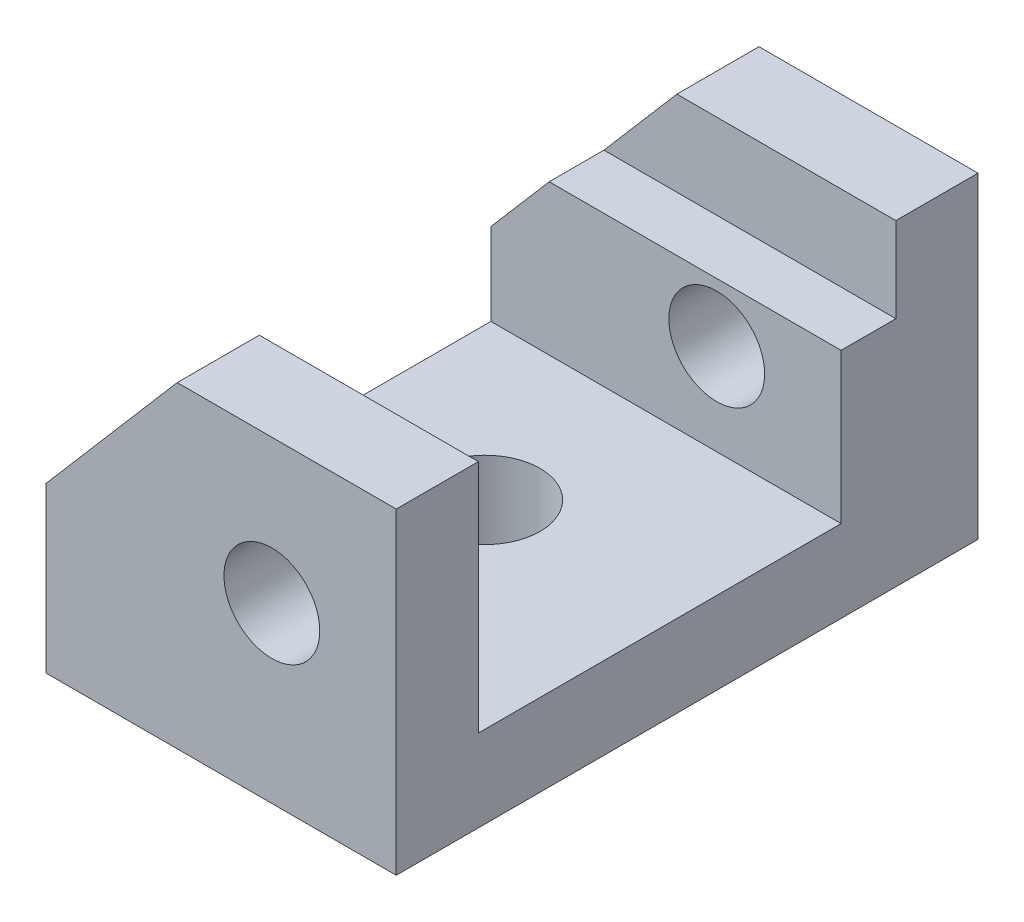
ISO-10303-21;
HEADER;
FILE_DESCRIPTION(('STEP AP214'),'2;1');
FILE_NAME('part.step','',(''),(''),'','','');
FILE_SCHEMA(('AUTOMOTIVE_DESIGN { 1 0 10303 214 1 1 1 1 }'));
ENDSEC;
DATA;
#1=APPLICATION_CONTEXT('core data for automotive mechanical design processes');
#2=APPLICATION_PROTOCOL_DEFINITION('international standard','automotive_design',2000,#1);
#3=PRODUCT_CONTEXT('',#1,'mechanical');
#4=PRODUCT('Part','Part','',(#3));
#5=PRODUCT_RELATED_PRODUCT_CATEGORY('part','',(#4));
#6=PRODUCT_DEFINITION_FORMATION('','',#4);
#7=PRODUCT_DEFINITION_CONTEXT('part definition',#1,'design');
#8=PRODUCT_DEFINITION('design','',#6,#7);
#9=PRODUCT_DEFINITION_SHAPE('','',#8);
#10=(LENGTH_UNIT() NAMED_UNIT(*) SI_UNIT(.MILLI.,.METRE.));
#11=(NAMED_UNIT(*) PLANE_ANGLE_UNIT() SI_UNIT($,.RADIAN.));
#12=(NAMED_UNIT(*) SI_UNIT($,.STERADIAN.) SOLID_ANGLE_UNIT());
#13=UNCERTAINTY_MEASURE_WITH_UNIT(LENGTH_MEASURE(1.E-05),#10,'distance_accuracy_value','');
#14=(GEOMETRIC_REPRESENTATION_CONTEXT(3) GLOBAL_UNCERTAINTY_ASSIGNED_CONTEXT((#13)) GLOBAL_UNIT_ASSIGNED_CONTEXT((#10,
#11,#12)) REPRESENTATION_CONTEXT('',''));
#15=CARTESIAN_POINT('',(0.,0.,0.));
#16=DIRECTION('',(0.,0.,1.));
#17=DIRECTION('',(1.,0.,0.));
#18=AXIS2_PLACEMENT_3D('',#15,#16,#17);
#19=CARTESIAN_POINT('',(-4.17941517840427,8.34482758620689,85.));
#20=DIRECTION('',(0.,-1.,0.));
#21=DIRECTION('',(0.,0.,-1.));
#22=AXIS2_PLACEMENT_3D('',#19,#20,#21);
#23=PLANE('',#22);
#24=DIRECTION('',(0.,0.,-1.));
#25=VECTOR('',#24,1.);
#26=CARTESIAN_POINT('',(27.8205848215957,8.34482758620689,85.));
#27=LINE('',#26,#25);
#28=CARTESIAN_POINT('',(27.8205848215957,8.34482758620689,85.));
#29=VERTEX_POINT('',#28);
#30=CARTESIAN_POINT('',(27.8205848215957,8.34482758620689,73.));
#31=VERTEX_POINT('',#30);
#32=EDGE_CURVE('E117',#29,#31,#27,.T.);
#33=ORIENTED_EDGE('',*,*,#32,.T.);
#34=DIRECTION('',(-1.,0.,0.));
#35=VECTOR('',#34,1.);
#36=CARTESIAN_POINT('',(27.8205848215957,8.34482758620689,73.));
#37=LINE('',#36,#35);
#38=CARTESIAN_POINT('',(-4.17941517840427,8.34482758620689,73.));
#39=VERTEX_POINT('',#38);
#40=EDGE_CURVE('E225',#31,#39,#37,.T.);
#41=ORIENTED_EDGE('',*,*,#40,.T.);
#42=DIRECTION('',(0.,0.,-1.));
#43=VECTOR('',#42,1.);
#44=CARTESIAN_POINT('',(-4.17941517840427,8.34482758620689,85.));
#45=LINE('',#44,#43);
#46=CARTESIAN_POINT('',(-4.17941517840427,8.34482758620689,85.));
#47=VERTEX_POINT('',#46);
#48=EDGE_CURVE('E130',#47,#39,#45,.T.);
#49=ORIENTED_EDGE('',*,*,#48,.F.);
#50=DIRECTION('',(-1.,0.,0.));
#51=VECTOR('',#50,1.);
#52=CARTESIAN_POINT('',(-4.17941517840427,8.34482758620689,85.));
#53=LINE('',#52,#51);
#54=EDGE_CURVE('E109',#29,#47,#53,.T.);
#55=ORIENTED_EDGE('',*,*,#54,.F.);
#56=EDGE_LOOP('',(#33,#41,#49,#55));
#57=FACE_BOUND('',#56,.T.);
#58=ADVANCED_FACE('F39',(#57),#23,.F.);
#59=CARTESIAN_POINT('',(-23.3518289715077,-14.,85.));
#60=DIRECTION('',(0.758925817715925,-0.651177090509343,0.));
#61=DIRECTION('',(0.651177090509344,0.758925817715926,0.));
#62=AXIS2_PLACEMENT_3D('',#59,#60,#61);
#63=PLANE('',#62);
#64=ORIENTED_EDGE('',*,*,#48,.T.);
#65=DIRECTION('',(-0.651177090509344,-0.758925817715926,0.));
#66=VECTOR('',#65,1.);
#67=CARTESIAN_POINT('',(-23.3518289715077,-14.,73.));
#68=LINE('',#67,#66);
#69=CARTESIAN_POINT('',(-23.3518289715077,-14.,73.));
#70=VERTEX_POINT('',#69);
#71=EDGE_CURVE('E177',#39,#70,#68,.T.);
#72=ORIENTED_EDGE('',*,*,#71,.T.);
#73=DIRECTION('',(0.,0.,-1.));
#74=VECTOR('',#73,1.);
#75=CARTESIAN_POINT('',(-23.3518289715077,-14.,85.));
#76=LINE('',#75,#74);
#77=CARTESIAN_POINT('',(-23.3518289715077,-14.,85.));
#78=VERTEX_POINT('',#77);
#79=EDGE_CURVE('E156',#78,#70,#76,.T.);
#80=ORIENTED_EDGE('',*,*,#79,.F.);
#81=DIRECTION('',(-0.651177090509344,-0.758925817715926,0.));
#82=VECTOR('',#81,1.);
#83=CARTESIAN_POINT('',(-23.3518289715077,-14.,85.));
#84=LINE('',#83,#82);
#85=EDGE_CURVE('E64',#47,#78,#84,.T.);
#86=ORIENTED_EDGE('',*,*,#85,.F.);
#87=EDGE_LOOP('',(#64,#72,#80,#86));
#88=FACE_BOUND('',#87,.T.);
#89=ADVANCED_FACE('F236',(#88),#63,.F.);
#90=CARTESIAN_POINT('',(9.64817102849229,-12.6551724137931,85.));
#91=DIRECTION('',(0.,0.,-1.));
#92=DIRECTION('',(-1.,0.,0.));
#93=AXIS2_PLACEMENT_3D('',#90,#91,#92);
#94=CYLINDRICAL_SURFACE('',#93,7.);
#95=CARTESIAN_POINT('',(9.64817102849229,-12.6551724137931,73.));
#96=DIRECTION('',(0.,0.,1.));
#97=DIRECTION('',(1.,0.,0.));
#98=AXIS2_PLACEMENT_3D('',#95,#96,#97);
#99=CIRCLE('',#98,7.);
#100=CARTESIAN_POINT('',(16.6481710284923,-12.6551724137931,73.));
#101=VERTEX_POINT('',#100);
#102=EDGE_CURVE('E174',#101,#101,#99,.T.);
#103=ORIENTED_EDGE('',*,*,#102,.F.);
#104=EDGE_LOOP('',(#103));
#105=FACE_BOUND('',#104,.T.);
#106=CARTESIAN_POINT('',(9.64817102849229,-12.6551724137931,85.));
#107=DIRECTION('',(0.,0.,1.));
#108=DIRECTION('',(1.,0.,0.));
#109=AXIS2_PLACEMENT_3D('',#106,#107,#108);
#110=CIRCLE('',#109,7.);
#111=CARTESIAN_POINT('',(16.6481710284923,-12.6551724137931,85.));
#112=VERTEX_POINT('',#111);
#113=EDGE_CURVE('E141',#112,#112,#110,.T.);
#114=ORIENTED_EDGE('',*,*,#113,.T.);
#115=EDGE_LOOP('',(#114));
#116=FACE_BOUND('',#115,.T.);
#117=ADVANCED_FACE('F342',(#105,#116),#94,.F.);
#118=CARTESIAN_POINT('',(0.,0.,85.));
#119=DIRECTION('',(0.,0.,-1.));
#120=DIRECTION('',(-1.,0.,0.));
#121=AXIS2_PLACEMENT_3D('',#118,#119,#120);
#122=PLANE('',#121);
#123=DIRECTION('',(0.,-1.,0.));
#124=VECTOR('',#123,1.);
#125=CARTESIAN_POINT('',(-23.3518289715077,-38.,85.));
#126=LINE('',#125,#124);
#127=CARTESIAN_POINT('',(-23.3518289715077,-38.,85.));
#128=VERTEX_POINT('',#127);
#129=EDGE_CURVE('E155',#78,#128,#126,.T.);
#130=ORIENTED_EDGE('',*,*,#129,.T.);
#131=DIRECTION('',(1.,0.,0.));
#132=VECTOR('',#131,1.);
#133=CARTESIAN_POINT('',(27.8205848215957,-38.,85.));
#134=LINE('',#133,#132);
#135=CARTESIAN_POINT('',(27.8205848215957,-38.,85.));
#136=VERTEX_POINT('',#135);
#137=EDGE_CURVE('E98',#128,#136,#134,.T.);
#138=ORIENTED_EDGE('',*,*,#137,.T.);
#139=DIRECTION('',(0.,1.,0.));
#140=VECTOR('',#139,1.);
#141=CARTESIAN_POINT('',(27.8205848215957,8.34482758620689,85.));
#142=LINE('',#141,#140);
#143=EDGE_CURVE('E104',#136,#29,#142,.T.);
#144=ORIENTED_EDGE('',*,*,#143,.T.);
#145=ORIENTED_EDGE('',*,*,#54,.T.);
#146=ORIENTED_EDGE('',*,*,#85,.T.);
#147=EDGE_LOOP('',(#130,#138,#144,#145,#146));
#148=FACE_BOUND('',#147,.T.);
#149=ORIENTED_EDGE('',*,*,#113,.F.);
#150=EDGE_LOOP('',(#149));
#151=FACE_BOUND('',#150,.T.);
#152=ADVANCED_FACE('F106',(#148,#151),#122,.F.);
#153=CARTESIAN_POINT('',(0.,0.,0.));
#154=DIRECTION('',(0.,0.,-1.));
#155=DIRECTION('',(-1.,0.,0.));
#156=AXIS2_PLACEMENT_3D('',#153,#154,#155);
#157=PLANE('',#156);
#158=DIRECTION('',(0.,-1.,0.));
#159=VECTOR('',#158,1.);
#160=CARTESIAN_POINT('',(-23.3518289715077,-38.,0.));
#161=LINE('',#160,#159);
#162=CARTESIAN_POINT('',(-23.3518289715077,-14.,0.));
#163=VERTEX_POINT('',#162);
#164=CARTESIAN_POINT('',(-23.3518289715077,-38.,0.));
#165=VERTEX_POINT('',#164);
#166=EDGE_CURVE('E137',#163,#165,#161,.T.);
#167=ORIENTED_EDGE('',*,*,#166,.F.);
#168=DIRECTION('',(-0.651177090509344,-0.758925817715926,0.));
#169=VECTOR('',#168,1.);
#170=CARTESIAN_POINT('',(-23.3518289715077,-14.,0.));
#171=LINE('',#170,#169);
#172=CARTESIAN_POINT('',(-4.17941517840427,8.34482758620689,0.));
#173=VERTEX_POINT('',#172);
#174=EDGE_CURVE('E152',#173,#163,#171,.T.);
#175=ORIENTED_EDGE('',*,*,#174,.F.);
#176=DIRECTION('',(-1.,0.,0.));
#177=VECTOR('',#176,1.);
#178=CARTESIAN_POINT('',(-4.17941517840427,8.34482758620689,0.));
#179=LINE('',#178,#177);
#180=CARTESIAN_POINT('',(27.8205848215957,8.34482758620689,0.));
#181=VERTEX_POINT('',#180);
#182=EDGE_CURVE('E148',#181,#173,#179,.T.);
#183=ORIENTED_EDGE('',*,*,#182,.F.);
#184=DIRECTION('',(0.,1.,0.));
#185=VECTOR('',#184,1.);
#186=CARTESIAN_POINT('',(27.8205848215957,8.34482758620689,0.));
#187=LINE('',#186,#185);
#188=CARTESIAN_POINT('',(27.8205848215957,-38.,0.));
#189=VERTEX_POINT('',#188);
#190=EDGE_CURVE('E144',#189,#181,#187,.T.);
#191=ORIENTED_EDGE('',*,*,#190,.F.);
#192=DIRECTION('',(1.,0.,0.));
#193=VECTOR('',#192,1.);
#194=CARTESIAN_POINT('',(27.8205848215957,-38.,0.));
#195=LINE('',#194,#193);
#196=EDGE_CURVE('E140',#165,#189,#195,.T.);
#197=ORIENTED_EDGE('',*,*,#196,.F.);
#198=EDGE_LOOP('',(#167,#175,#183,#191,#197));
#199=FACE_BOUND('',#198,.T.);
#200=CARTESIAN_POINT('',(9.64817102849229,-12.6551724137931,0.));
#201=DIRECTION('',(0.,0.,1.));
#202=DIRECTION('',(1.,0.,0.));
#203=AXIS2_PLACEMENT_3D('',#200,#201,#202);
#204=CIRCLE('',#203,7.);
#205=CARTESIAN_POINT('',(16.6481710284923,-12.6551724137931,0.));
#206=VERTEX_POINT('',#205);
#207=EDGE_CURVE('E231',#206,#206,#204,.T.);
#208=ORIENTED_EDGE('',*,*,#207,.T.);
#209=EDGE_LOOP('',(#208));
#210=FACE_BOUND('',#209,.T.);
#211=ADVANCED_FACE('F199',(#199,#210),#157,.T.);
#212=CARTESIAN_POINT('',(-23.3518289715077,-38.,85.));
#213=DIRECTION('',(1.,0.,0.));
#214=DIRECTION('',(0.,0.,-1.));
#215=AXIS2_PLACEMENT_3D('',#212,#213,#214);
#216=PLANE('',#215);
#217=ORIENTED_EDGE('',*,*,#79,.T.);
#218=DIRECTION('',(0.,1.,0.));
#219=VECTOR('',#218,1.);
#220=CARTESIAN_POINT('',(-23.3518289715077,-26.,73.));
#221=LINE('',#220,#219);
#222=CARTESIAN_POINT('',(-23.3518289715077,-26.,73.));
#223=VERTEX_POINT('',#222);
#224=EDGE_CURVE('E228',#223,#70,#221,.T.);
#225=ORIENTED_EDGE('',*,*,#224,.F.);
#226=DIRECTION('',(0.,0.,1.));
#227=VECTOR('',#226,1.);
#228=CARTESIAN_POINT('',(-23.3518289715077,-26.,20.));
#229=LINE('',#228,#227);
#230=CARTESIAN_POINT('',(-23.3518289715077,-26.,20.));
#231=VERTEX_POINT('',#230);
#232=EDGE_CURVE('E265',#231,#223,#229,.T.);
#233=ORIENTED_EDGE('',*,*,#232,.F.);
#234=DIRECTION('',(0.,-1.,0.));
#235=VECTOR('',#234,1.);
#236=CARTESIAN_POINT('',(-23.3518289715077,-4.0719851546594,20.));
#237=LINE('',#236,#235);
#238=CARTESIAN_POINT('',(-23.3518289715077,-14.,20.));
#239=VERTEX_POINT('',#238);
#240=EDGE_CURVE('E269',#239,#231,#237,.T.);
#241=ORIENTED_EDGE('',*,*,#240,.F.);
#242=EDGE_CURVE('E89',#239,#163,#76,.T.);
#243=ORIENTED_EDGE('',*,*,#242,.T.);
#244=ORIENTED_EDGE('',*,*,#166,.T.);
#245=DIRECTION('',(0.,0.,-1.));
#246=VECTOR('',#245,1.);
#247=CARTESIAN_POINT('',(-23.3518289715077,-38.,85.));
#248=LINE('',#247,#246);
#249=EDGE_CURVE('E165',#128,#165,#248,.T.);
#250=ORIENTED_EDGE('',*,*,#249,.F.);
#251=ORIENTED_EDGE('',*,*,#129,.F.);
#252=EDGE_LOOP('',(#217,#225,#233,#241,#243,#244,#250,#251));
#253=FACE_BOUND('',#252,.T.);
#254=ADVANCED_FACE('F41',(#253),#216,.F.);
#255=CARTESIAN_POINT('',(27.8205848215957,-38.,85.));
#256=DIRECTION('',(0.,1.,0.));
#257=DIRECTION('',(-1.,0.,0.));
#258=AXIS2_PLACEMENT_3D('',#255,#256,#257);
#259=PLANE('',#258);
#260=CARTESIAN_POINT('',(-1.17941517840427,-38.,43.));
#261=DIRECTION('',(0.,1.,0.));
#262=DIRECTION('',(0.,0.,1.));
#263=AXIS2_PLACEMENT_3D('',#260,#261,#262);
#264=CIRCLE('',#263,8.);
#265=CARTESIAN_POINT('',(-1.17941517840427,-38.,51.));
#266=VERTEX_POINT('',#265);
#267=EDGE_CURVE('E274',#266,#266,#264,.T.);
#268=ORIENTED_EDGE('',*,*,#267,.T.);
#269=EDGE_LOOP('',(#268));
#270=FACE_BOUND('',#269,.T.);
#271=ORIENTED_EDGE('',*,*,#196,.T.);
#272=DIRECTION('',(0.,0.,-1.));
#273=VECTOR('',#272,1.);
#274=CARTESIAN_POINT('',(27.8205848215957,-38.,85.));
#275=LINE('',#274,#273);
#276=EDGE_CURVE('E126',#136,#189,#275,.T.);
#277=ORIENTED_EDGE('',*,*,#276,.F.);
#278=ORIENTED_EDGE('',*,*,#137,.F.);
#279=ORIENTED_EDGE('',*,*,#249,.T.);
#280=EDGE_LOOP('',(#271,#277,#278,#279));
#281=FACE_BOUND('',#280,.T.);
#282=ADVANCED_FACE('F298',(#270,#281),#259,.F.);
#283=CARTESIAN_POINT('',(27.8205848215957,8.34482758620689,85.));
#284=DIRECTION('',(-1.,0.,0.));
#285=DIRECTION('',(0.,-1.,0.));
#286=AXIS2_PLACEMENT_3D('',#283,#284,#285);
#287=PLANE('',#286);
#288=DIRECTION('',(0.,0.,1.));
#289=VECTOR('',#288,1.);
#290=CARTESIAN_POINT('',(27.8205848215957,-26.,20.));
#291=LINE('',#290,#289);
#292=CARTESIAN_POINT('',(27.8205848215957,-26.,20.));
#293=VERTEX_POINT('',#292);
#294=CARTESIAN_POINT('',(27.8205848215957,-26.,73.));
#295=VERTEX_POINT('',#294);
#296=EDGE_CURVE('E234',#293,#295,#291,.T.);
#297=ORIENTED_EDGE('',*,*,#296,.T.);
#298=DIRECTION('',(0.,1.,0.));
#299=VECTOR('',#298,1.);
#300=CARTESIAN_POINT('',(27.8205848215957,-26.,73.));
#301=LINE('',#300,#299);
#302=EDGE_CURVE('E122',#295,#31,#301,.T.);
#303=ORIENTED_EDGE('',*,*,#302,.T.);
#304=ORIENTED_EDGE('',*,*,#32,.F.);
#305=ORIENTED_EDGE('',*,*,#143,.F.);
#306=ORIENTED_EDGE('',*,*,#276,.T.);
#307=ORIENTED_EDGE('',*,*,#190,.T.);
#308=CARTESIAN_POINT('',(27.8205848215957,8.34482758620689,12.));
#309=VERTEX_POINT('',#308);
#310=EDGE_CURVE('E127',#309,#181,#27,.T.);
#311=ORIENTED_EDGE('',*,*,#310,.F.);
#312=DIRECTION('',(0.,-1.,0.));
#313=VECTOR('',#312,1.);
#314=CARTESIAN_POINT('',(27.8205848215957,8.34482758620689,12.));
#315=LINE('',#314,#313);
#316=CARTESIAN_POINT('',(27.8205848215957,-4.0719851546594,12.));
#317=VERTEX_POINT('',#316);
#318=EDGE_CURVE('E285',#309,#317,#315,.T.);
#319=ORIENTED_EDGE('',*,*,#318,.T.);
#320=DIRECTION('',(0.,0.,1.));
#321=VECTOR('',#320,1.);
#322=CARTESIAN_POINT('',(27.8205848215957,-4.0719851546594,12.));
#323=LINE('',#322,#321);
#324=CARTESIAN_POINT('',(27.8205848215957,-4.0719851546594,20.));
#325=VERTEX_POINT('',#324);
#326=EDGE_CURVE('E281',#317,#325,#323,.T.);
#327=ORIENTED_EDGE('',*,*,#326,.T.);
#328=DIRECTION('',(0.,-1.,0.));
#329=VECTOR('',#328,1.);
#330=CARTESIAN_POINT('',(27.8205848215957,-4.0719851546594,20.));
#331=LINE('',#330,#329);
#332=EDGE_CURVE('E277',#325,#293,#331,.T.);
#333=ORIENTED_EDGE('',*,*,#332,.T.);
#334=EDGE_LOOP('',(#297,#303,#304,#305,#306,#307,#311,#319,#327,#333));
#335=FACE_BOUND('',#334,.T.);
#336=ADVANCED_FACE('F119',(#335),#287,.F.);
#337=CARTESIAN_POINT('',(-4.17941517840427,8.34482758620689,12.));
#338=VERTEX_POINT('',#337);
#339=EDGE_CURVE('E160',#338,#173,#45,.T.);
#340=ORIENTED_EDGE('',*,*,#339,.F.);
#341=DIRECTION('',(-1.,0.,0.));
#342=VECTOR('',#341,1.);
#343=CARTESIAN_POINT('',(27.8205848215957,8.34482758620689,12.));
#344=LINE('',#343,#342);
#345=EDGE_CURVE('E55',#309,#338,#344,.T.);
#346=ORIENTED_EDGE('',*,*,#345,.F.);
#347=ORIENTED_EDGE('',*,*,#310,.T.);
#348=ORIENTED_EDGE('',*,*,#182,.T.);
#349=EDGE_LOOP('',(#340,#346,#347,#348));
#350=FACE_BOUND('',#349,.T.);
#351=ADVANCED_FACE('F187',(#350),#23,.F.);
#352=ORIENTED_EDGE('',*,*,#242,.F.);
#353=DIRECTION('',(0.651177090509344,0.758925817715926,0.));
#354=VECTOR('',#353,1.);
#355=CARTESIAN_POINT('',(-23.3518289715077,-14.,20.));
#356=LINE('',#355,#354);
#357=CARTESIAN_POINT('',(-14.8333470980364,-4.0719851546594,20.));
#358=VERTEX_POINT('',#357);
#359=EDGE_CURVE('E172',#239,#358,#356,.T.);
#360=ORIENTED_EDGE('',*,*,#359,.T.);
#361=DIRECTION('',(0.,0.,-1.));
#362=VECTOR('',#361,1.);
#363=CARTESIAN_POINT('',(-14.8333470980365,-4.0719851546594,85.));
#364=LINE('',#363,#362);
#365=CARTESIAN_POINT('',(-14.8333470980364,-4.07198515465939,12.));
#366=VERTEX_POINT('',#365);
#367=EDGE_CURVE('E11',#358,#366,#364,.T.);
#368=ORIENTED_EDGE('',*,*,#367,.T.);
#369=DIRECTION('',(0.651177090509344,0.758925817715926,0.));
#370=VECTOR('',#369,1.);
#371=CARTESIAN_POINT('',(-23.3518289715077,-14.,12.));
#372=LINE('',#371,#370);
#373=EDGE_CURVE('E48',#366,#338,#372,.T.);
#374=ORIENTED_EDGE('',*,*,#373,.T.);
#375=ORIENTED_EDGE('',*,*,#339,.T.);
#376=ORIENTED_EDGE('',*,*,#174,.T.);
#377=EDGE_LOOP('',(#352,#360,#368,#374,#375,#376));
#378=FACE_BOUND('',#377,.T.);
#379=ADVANCED_FACE('F181',(#378),#63,.F.);
#380=CARTESIAN_POINT('',(9.64817102849229,-12.6551724137931,20.));
#381=DIRECTION('',(0.,0.,-1.));
#382=DIRECTION('',(0.,1.,0.));
#383=AXIS2_PLACEMENT_3D('',#380,#381,#382);
#384=CIRCLE('',#383,7.);
#385=CARTESIAN_POINT('',(9.64817102849229,-5.65517241379311,20.));
#386=VERTEX_POINT('',#385);
#387=EDGE_CURVE('E168',#386,#386,#384,.T.);
#388=ORIENTED_EDGE('',*,*,#387,.F.);
#389=EDGE_LOOP('',(#388));
#390=FACE_BOUND('',#389,.T.);
#391=ORIENTED_EDGE('',*,*,#207,.F.);
#392=EDGE_LOOP('',(#391));
#393=FACE_BOUND('',#392,.T.);
#394=ADVANCED_FACE('F350',(#390,#393),#94,.F.);
#395=CARTESIAN_POINT('',(27.8205848215957,-4.0719851546594,12.));
#396=DIRECTION('',(0.,-1.,0.));
#397=DIRECTION('',(0.,0.,-1.));
#398=AXIS2_PLACEMENT_3D('',#395,#396,#397);
#399=PLANE('',#398);
#400=DIRECTION('',(-1.,0.,0.));
#401=VECTOR('',#400,1.);
#402=CARTESIAN_POINT('',(27.8205848215957,-4.0719851546594,20.));
#403=LINE('',#402,#401);
#404=EDGE_CURVE('E256',#325,#358,#403,.T.);
#405=ORIENTED_EDGE('',*,*,#404,.F.);
#406=ORIENTED_EDGE('',*,*,#326,.F.);
#407=DIRECTION('',(-1.,0.,0.));
#408=VECTOR('',#407,1.);
#409=CARTESIAN_POINT('',(27.8205848215957,-4.0719851546594,12.));
#410=LINE('',#409,#408);
#411=EDGE_CURVE('E253',#317,#366,#410,.T.);
#412=ORIENTED_EDGE('',*,*,#411,.T.);
#413=ORIENTED_EDGE('',*,*,#367,.F.);
#414=EDGE_LOOP('',(#405,#406,#412,#413));
#415=FACE_BOUND('',#414,.T.);
#416=ADVANCED_FACE('F327',(#415),#399,.F.);
#417=CARTESIAN_POINT('',(27.8205848215957,8.34482758620689,12.));
#418=DIRECTION('',(0.,0.,-1.));
#419=DIRECTION('',(0.,1.,0.));
#420=AXIS2_PLACEMENT_3D('',#417,#418,#419);
#421=PLANE('',#420);
#422=ORIENTED_EDGE('',*,*,#411,.F.);
#423=ORIENTED_EDGE('',*,*,#318,.F.);
#424=ORIENTED_EDGE('',*,*,#345,.T.);
#425=ORIENTED_EDGE('',*,*,#373,.F.);
#426=EDGE_LOOP('',(#422,#423,#424,#425));
#427=FACE_BOUND('',#426,.T.);
#428=ADVANCED_FACE('F323',(#427),#421,.F.);
#429=CARTESIAN_POINT('',(27.8205848215957,-26.,73.));
#430=DIRECTION('',(0.,0.,1.));
#431=DIRECTION('',(1.,0.,0.));
#432=AXIS2_PLACEMENT_3D('',#429,#430,#431);
#433=PLANE('',#432);
#434=ORIENTED_EDGE('',*,*,#102,.T.);
#435=EDGE_LOOP('',(#434));
#436=FACE_BOUND('',#435,.T.);
#437=ORIENTED_EDGE('',*,*,#40,.F.);
#438=ORIENTED_EDGE('',*,*,#302,.F.);
#439=DIRECTION('',(-1.,0.,0.));
#440=VECTOR('',#439,1.);
#441=CARTESIAN_POINT('',(27.8205848215957,-26.,73.));
#442=LINE('',#441,#440);
#443=EDGE_CURVE('E173',#295,#223,#442,.T.);
#444=ORIENTED_EDGE('',*,*,#443,.T.);
#445=ORIENTED_EDGE('',*,*,#224,.T.);
#446=ORIENTED_EDGE('',*,*,#71,.F.);
#447=EDGE_LOOP('',(#437,#438,#444,#445,#446));
#448=FACE_BOUND('',#447,.T.);
#449=ADVANCED_FACE('F224',(#436,#448),#433,.F.);
#450=CARTESIAN_POINT('',(27.8205848215957,-4.0719851546594,20.));
#451=DIRECTION('',(0.,0.,-1.));
#452=DIRECTION('',(0.,1.,0.));
#453=AXIS2_PLACEMENT_3D('',#450,#451,#452);
#454=PLANE('',#453);
#455=ORIENTED_EDGE('',*,*,#387,.T.);
#456=EDGE_LOOP('',(#455));
#457=FACE_BOUND('',#456,.T.);
#458=ORIENTED_EDGE('',*,*,#240,.T.);
#459=DIRECTION('',(-1.,0.,0.));
#460=VECTOR('',#459,1.);
#461=CARTESIAN_POINT('',(27.8205848215957,-26.,20.));
#462=LINE('',#461,#460);
#463=EDGE_CURVE('E259',#293,#231,#462,.T.);
#464=ORIENTED_EDGE('',*,*,#463,.F.);
#465=ORIENTED_EDGE('',*,*,#332,.F.);
#466=ORIENTED_EDGE('',*,*,#404,.T.);
#467=ORIENTED_EDGE('',*,*,#359,.F.);
#468=EDGE_LOOP('',(#458,#464,#465,#466,#467));
#469=FACE_BOUND('',#468,.T.);
#470=ADVANCED_FACE('F309',(#457,#469),#454,.F.);
#471=CARTESIAN_POINT('',(27.8205848215957,-26.,20.));
#472=DIRECTION('',(0.,-1.,0.));
#473=DIRECTION('',(0.,0.,-1.));
#474=AXIS2_PLACEMENT_3D('',#471,#472,#473);
#475=PLANE('',#474);
#476=CARTESIAN_POINT('',(-1.17941517840427,-26.,43.));
#477=DIRECTION('',(0.,1.,0.));
#478=DIRECTION('',(0.,0.,1.));
#479=AXIS2_PLACEMENT_3D('',#476,#477,#478);
#480=CIRCLE('',#479,8.);
#481=CARTESIAN_POINT('',(-1.17941517840427,-26.,51.));
#482=VERTEX_POINT('',#481);
#483=EDGE_CURVE('E290',#482,#482,#480,.T.);
#484=ORIENTED_EDGE('',*,*,#483,.F.);
#485=EDGE_LOOP('',(#484));
#486=FACE_BOUND('',#485,.T.);
#487=ORIENTED_EDGE('',*,*,#232,.T.);
#488=ORIENTED_EDGE('',*,*,#443,.F.);
#489=ORIENTED_EDGE('',*,*,#296,.F.);
#490=ORIENTED_EDGE('',*,*,#463,.T.);
#491=EDGE_LOOP('',(#487,#488,#489,#490));
#492=FACE_BOUND('',#491,.T.);
#493=ADVANCED_FACE('F303',(#486,#492),#475,.F.);
#494=CARTESIAN_POINT('',(-1.17941517840427,-38.,43.));
#495=DIRECTION('',(0.,1.,0.));
#496=DIRECTION('',(0.,0.,1.));
#497=AXIS2_PLACEMENT_3D('',#494,#495,#496);
#498=CYLINDRICAL_SURFACE('',#497,8.);
#499=ORIENTED_EDGE('',*,*,#267,.F.);
#500=EDGE_LOOP('',(#499));
#501=FACE_BOUND('',#500,.T.);
#502=ORIENTED_EDGE('',*,*,#483,.T.);
#503=EDGE_LOOP('',(#502));
#504=FACE_BOUND('',#503,.T.);
#505=ADVANCED_FACE('F300',(#501,#504),#498,.F.);
#506=CLOSED_SHELL('',(#58,#89,#117,#152,#211,#254,#282,#336,#351,#379,#394,#416,#428,#449,#470,
#493,#505));
#507=MANIFOLD_SOLID_BREP('B2',#506);
#508=ADVANCED_BREP_SHAPE_REPRESENTATION('',(#18,#507),#14);
#509=SHAPE_DEFINITION_REPRESENTATION(#9,#508);
ENDSEC;
END-ISO-10303-21;
